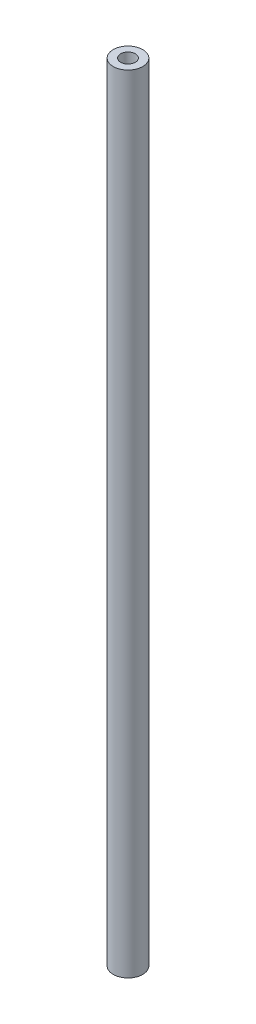
ISO-10303-21;
HEADER;
FILE_DESCRIPTION(('STEP AP214'),'2;1');
FILE_NAME('part.step','',(''),(''),'','','');
FILE_SCHEMA(('AUTOMOTIVE_DESIGN { 1 0 10303 214 1 1 1 1 }'));
ENDSEC;
DATA;
#1=APPLICATION_CONTEXT('core data for automotive mechanical design processes');
#2=APPLICATION_PROTOCOL_DEFINITION('international standard','automotive_design',2000,#1);
#3=PRODUCT_CONTEXT('',#1,'mechanical');
#4=PRODUCT('Part','Part','',(#3));
#5=PRODUCT_RELATED_PRODUCT_CATEGORY('part','',(#4));
#6=PRODUCT_DEFINITION_FORMATION('','',#4);
#7=PRODUCT_DEFINITION_CONTEXT('part definition',#1,'design');
#8=PRODUCT_DEFINITION('design','',#6,#7);
#9=PRODUCT_DEFINITION_SHAPE('','',#8);
#10=(LENGTH_UNIT() NAMED_UNIT(*) SI_UNIT(.MILLI.,.METRE.));
#11=(NAMED_UNIT(*) PLANE_ANGLE_UNIT() SI_UNIT($,.RADIAN.));
#12=(NAMED_UNIT(*) SI_UNIT($,.STERADIAN.) SOLID_ANGLE_UNIT());
#13=UNCERTAINTY_MEASURE_WITH_UNIT(LENGTH_MEASURE(1.E-05),#10,'distance_accuracy_value','');
#14=(GEOMETRIC_REPRESENTATION_CONTEXT(3) GLOBAL_UNCERTAINTY_ASSIGNED_CONTEXT((#13)) GLOBAL_UNIT_ASSIGNED_CONTEXT((#10,
#11,#12)) REPRESENTATION_CONTEXT('',''));
#15=CARTESIAN_POINT('',(0.,0.,0.));
#16=DIRECTION('',(0.,0.,1.));
#17=DIRECTION('',(1.,0.,0.));
#18=AXIS2_PLACEMENT_3D('',#15,#16,#17);
#19=CARTESIAN_POINT('',(0.,160.,0.));
#20=DIRECTION('',(0.,-1.,0.));
#21=DIRECTION('',(0.,0.,-1.));
#22=AXIS2_PLACEMENT_3D('',#19,#20,#21);
#23=CYLINDRICAL_SURFACE('',#22,1.5);
#24=CARTESIAN_POINT('',(0.,160.,0.));
#25=DIRECTION('',(0.,1.,0.));
#26=DIRECTION('',(0.,0.,1.));
#27=AXIS2_PLACEMENT_3D('',#24,#25,#26);
#28=CIRCLE('',#27,1.5);
#29=CARTESIAN_POINT('',(0.,160.,1.5));
#30=VERTEX_POINT('',#29);
#31=EDGE_CURVE('E52',#30,#30,#28,.T.);
#32=ORIENTED_EDGE('',*,*,#31,.T.);
#33=EDGE_LOOP('',(#32));
#34=FACE_BOUND('',#33,.T.);
#35=CARTESIAN_POINT('',(0.,5.,0.));
#36=DIRECTION('',(0.,-1.,0.));
#37=DIRECTION('',(0.,0.,-1.));
#38=AXIS2_PLACEMENT_3D('',#35,#36,#37);
#39=CIRCLE('',#38,1.5);
#40=CARTESIAN_POINT('',(0.,5.,-1.5));
#41=VERTEX_POINT('',#40);
#42=EDGE_CURVE('E41',#41,#41,#39,.T.);
#43=ORIENTED_EDGE('',*,*,#42,.T.);
#44=EDGE_LOOP('',(#43));
#45=FACE_BOUND('',#44,.T.);
#46=ADVANCED_FACE('F37',(#34,#45),#23,.F.);
#47=CARTESIAN_POINT('',(0.,160.,0.));
#48=DIRECTION('',(0.,1.,0.));
#49=DIRECTION('',(0.,0.,1.));
#50=AXIS2_PLACEMENT_3D('',#47,#48,#49);
#51=PLANE('',#50);
#52=CARTESIAN_POINT('',(0.,160.,0.));
#53=DIRECTION('',(0.,1.,0.));
#54=DIRECTION('',(0.,0.,1.));
#55=AXIS2_PLACEMENT_3D('',#52,#53,#54);
#56=CIRCLE('',#55,3.);
#57=CARTESIAN_POINT('',(0.,160.,3.));
#58=VERTEX_POINT('',#57);
#59=EDGE_CURVE('E10',#58,#58,#56,.T.);
#60=ORIENTED_EDGE('',*,*,#59,.T.);
#61=EDGE_LOOP('',(#60));
#62=FACE_BOUND('',#61,.T.);
#63=ORIENTED_EDGE('',*,*,#31,.F.);
#64=EDGE_LOOP('',(#63));
#65=FACE_BOUND('',#64,.T.);
#66=ADVANCED_FACE('F73',(#62,#65),#51,.T.);
#67=CARTESIAN_POINT('',(0.,0.,0.));
#68=DIRECTION('',(0.,1.,0.));
#69=DIRECTION('',(0.,0.,1.));
#70=AXIS2_PLACEMENT_3D('',#67,#68,#69);
#71=PLANE('',#70);
#72=CARTESIAN_POINT('',(0.,0.,0.));
#73=DIRECTION('',(0.,1.,0.));
#74=DIRECTION('',(0.,0.,1.));
#75=AXIS2_PLACEMENT_3D('',#72,#73,#74);
#76=CIRCLE('',#75,3.);
#77=CARTESIAN_POINT('',(0.,0.,3.));
#78=VERTEX_POINT('',#77);
#79=EDGE_CURVE('E46',#78,#78,#76,.T.);
#80=ORIENTED_EDGE('',*,*,#79,.F.);
#81=EDGE_LOOP('',(#80));
#82=FACE_BOUND('',#81,.T.);
#83=ADVANCED_FACE('F69',(#82),#71,.F.);
#84=CARTESIAN_POINT('',(0.,160.,0.));
#85=DIRECTION('',(0.,-1.,0.));
#86=DIRECTION('',(0.,0.,-1.));
#87=AXIS2_PLACEMENT_3D('',#84,#85,#86);
#88=CYLINDRICAL_SURFACE('',#87,3.);
#89=ORIENTED_EDGE('',*,*,#79,.T.);
#90=EDGE_LOOP('',(#89));
#91=FACE_BOUND('',#90,.T.);
#92=ORIENTED_EDGE('',*,*,#59,.F.);
#93=EDGE_LOOP('',(#92));
#94=FACE_BOUND('',#93,.T.);
#95=ADVANCED_FACE('F39',(#91,#94),#88,.T.);
#96=CARTESIAN_POINT('',(0.,5.,0.));
#97=DIRECTION('',(0.,-1.,0.));
#98=DIRECTION('',(0.,0.,-1.));
#99=AXIS2_PLACEMENT_3D('',#96,#97,#98);
#100=PLANE('',#99);
#101=ORIENTED_EDGE('',*,*,#42,.F.);
#102=EDGE_LOOP('',(#101));
#103=FACE_BOUND('',#102,.T.);
#104=ADVANCED_FACE('F63',(#103),#100,.F.);
#105=CLOSED_SHELL('',(#46,#66,#83,#95,#104));
#106=MANIFOLD_SOLID_BREP('B2',#105);
#107=ADVANCED_BREP_SHAPE_REPRESENTATION('',(#18,#106),#14);
#108=SHAPE_DEFINITION_REPRESENTATION(#9,#107);
ENDSEC;
END-ISO-10303-21;
